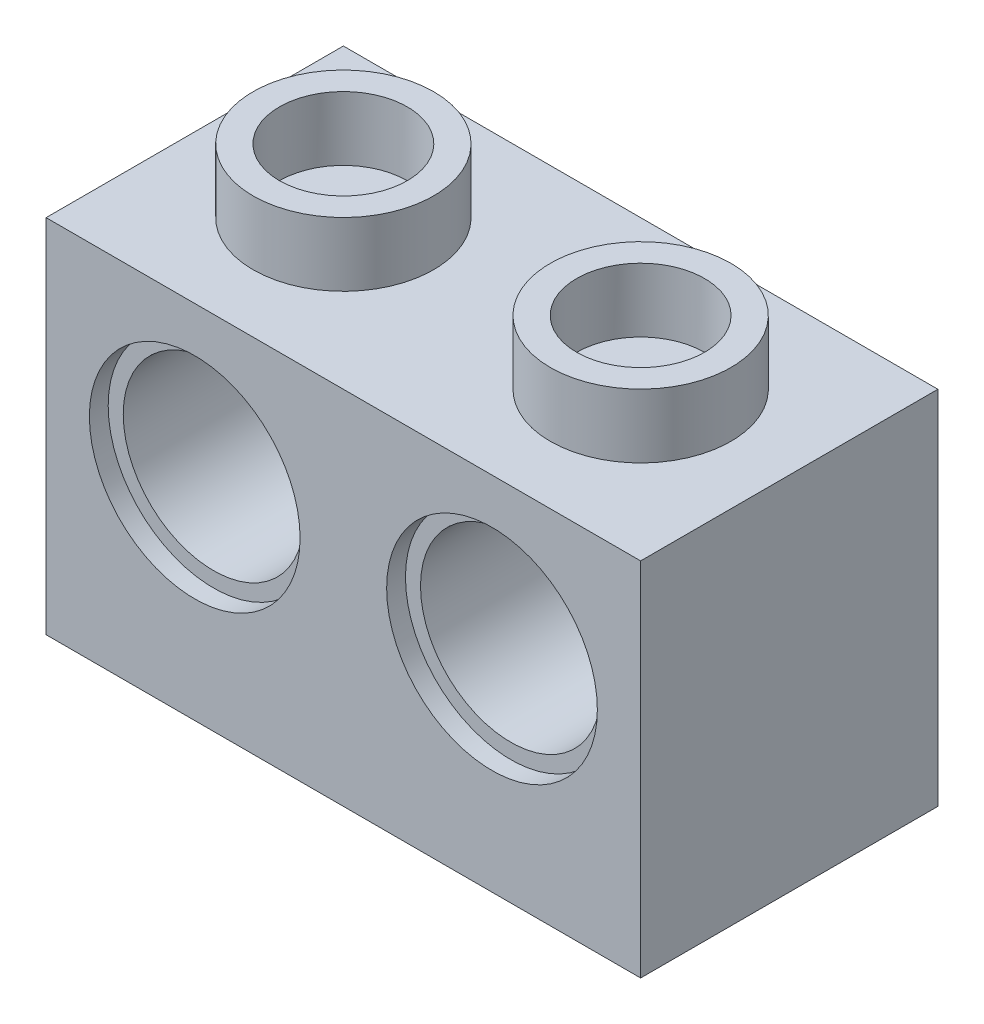
ISO-10303-21;
HEADER;
FILE_DESCRIPTION(('STEP AP214'),'2;1');
FILE_NAME('part.step','',(''),(''),'','','');
FILE_SCHEMA(('AUTOMOTIVE_DESIGN { 1 0 10303 214 1 1 1 1 }'));
ENDSEC;
DATA;
#1=APPLICATION_CONTEXT('core data for automotive mechanical design processes');
#2=APPLICATION_PROTOCOL_DEFINITION('international standard','automotive_design',2000,#1);
#3=PRODUCT_CONTEXT('',#1,'mechanical');
#4=PRODUCT('Part','Part','',(#3));
#5=PRODUCT_RELATED_PRODUCT_CATEGORY('part','',(#4));
#6=PRODUCT_DEFINITION_FORMATION('','',#4);
#7=PRODUCT_DEFINITION_CONTEXT('part definition',#1,'design');
#8=PRODUCT_DEFINITION('design','',#6,#7);
#9=PRODUCT_DEFINITION_SHAPE('','',#8);
#10=(LENGTH_UNIT() NAMED_UNIT(*) SI_UNIT(.MILLI.,.METRE.));
#11=(NAMED_UNIT(*) PLANE_ANGLE_UNIT() SI_UNIT($,.RADIAN.));
#12=(NAMED_UNIT(*) SI_UNIT($,.STERADIAN.) SOLID_ANGLE_UNIT());
#13=UNCERTAINTY_MEASURE_WITH_UNIT(LENGTH_MEASURE(1.E-05),#10,'distance_accuracy_value','');
#14=(GEOMETRIC_REPRESENTATION_CONTEXT(3) GLOBAL_UNCERTAINTY_ASSIGNED_CONTEXT((#13)) GLOBAL_UNIT_ASSIGNED_CONTEXT((#10,
#11,#12)) REPRESENTATION_CONTEXT('',''));
#15=CARTESIAN_POINT('',(0.,0.,0.));
#16=DIRECTION('',(0.,0.,1.));
#17=DIRECTION('',(1.,0.,0.));
#18=AXIS2_PLACEMENT_3D('',#15,#16,#17);
#19=CARTESIAN_POINT('',(3.95,5.5991623790835,-9.6));
#20=DIRECTION('',(0.,0.,1.));
#21=DIRECTION('',(1.,0.,0.));
#22=AXIS2_PLACEMENT_3D('',#19,#20,#21);
#23=CYLINDRICAL_SURFACE('',#22,2.4);
#24=CARTESIAN_POINT('',(3.95,5.5991623790835,-0.5));
#25=DIRECTION('',(0.,0.,1.));
#26=DIRECTION('',(1.,0.,0.));
#27=AXIS2_PLACEMENT_3D('',#24,#25,#26);
#28=CIRCLE('',#27,2.4);
#29=CARTESIAN_POINT('',(6.35,5.5991623790835,-0.5));
#30=VERTEX_POINT('',#29);
#31=EDGE_CURVE('E125',#30,#30,#28,.F.);
#32=ORIENTED_EDGE('',*,*,#31,.F.);
#33=EDGE_LOOP('',(#32));
#34=FACE_BOUND('',#33,.T.);
#35=CARTESIAN_POINT('',(3.95,5.5991623790835,-7.4));
#36=DIRECTION('',(0.,0.,-1.));
#37=DIRECTION('',(-1.,0.,0.));
#38=AXIS2_PLACEMENT_3D('',#35,#36,#37);
#39=CIRCLE('',#38,2.4);
#40=CARTESIAN_POINT('',(1.55,5.5991623790835,-7.4));
#41=VERTEX_POINT('',#40);
#42=EDGE_CURVE('E116',#41,#41,#39,.F.);
#43=ORIENTED_EDGE('',*,*,#42,.F.);
#44=EDGE_LOOP('',(#43));
#45=FACE_BOUND('',#44,.T.);
#46=ADVANCED_FACE('F32',(#34,#45),#23,.F.);
#47=CARTESIAN_POINT('',(0.,9.6,0.));
#48=DIRECTION('',(1.,0.,0.));
#49=DIRECTION('',(0.,0.,-1.));
#50=AXIS2_PLACEMENT_3D('',#47,#48,#49);
#51=PLANE('',#50);
#52=DIRECTION('',(0.,0.,1.));
#53=VECTOR('',#52,1.);
#54=CARTESIAN_POINT('',(0.,0.,0.));
#55=LINE('',#54,#53);
#56=CARTESIAN_POINT('',(0.,0.,-7.9));
#57=VERTEX_POINT('',#56);
#58=CARTESIAN_POINT('',(0.,0.,0.));
#59=VERTEX_POINT('',#58);
#60=EDGE_CURVE('E80',#57,#59,#55,.T.);
#61=ORIENTED_EDGE('',*,*,#60,.T.);
#62=DIRECTION('',(0.,-1.,0.));
#63=VECTOR('',#62,1.);
#64=CARTESIAN_POINT('',(0.,9.6,0.));
#65=LINE('',#64,#63);
#66=CARTESIAN_POINT('',(0.,9.6,0.));
#67=VERTEX_POINT('',#66);
#68=EDGE_CURVE('E36',#67,#59,#65,.T.);
#69=ORIENTED_EDGE('',*,*,#68,.F.);
#70=DIRECTION('',(0.,0.,1.));
#71=VECTOR('',#70,1.);
#72=CARTESIAN_POINT('',(0.,9.6,0.));
#73=LINE('',#72,#71);
#74=CARTESIAN_POINT('',(0.,9.6,-7.9));
#75=VERTEX_POINT('',#74);
#76=EDGE_CURVE('E82',#75,#67,#73,.T.);
#77=ORIENTED_EDGE('',*,*,#76,.F.);
#78=DIRECTION('',(0.,-1.,0.));
#79=VECTOR('',#78,1.);
#80=CARTESIAN_POINT('',(0.,9.6,-7.9));
#81=LINE('',#80,#79);
#82=EDGE_CURVE('E137',#75,#57,#81,.T.);
#83=ORIENTED_EDGE('',*,*,#82,.T.);
#84=EDGE_LOOP('',(#61,#69,#77,#83));
#85=FACE_BOUND('',#84,.T.);
#86=ADVANCED_FACE('F34',(#85),#51,.F.);
#87=CARTESIAN_POINT('',(0.,9.6,0.));
#88=DIRECTION('',(0.,0.,-1.));
#89=DIRECTION('',(-1.,0.,0.));
#90=AXIS2_PLACEMENT_3D('',#87,#88,#89);
#91=PLANE('',#90);
#92=CARTESIAN_POINT('',(3.95,5.5991623790835,0.));
#93=DIRECTION('',(0.,0.,1.));
#94=DIRECTION('',(1.,0.,0.));
#95=AXIS2_PLACEMENT_3D('',#92,#93,#94);
#96=CIRCLE('',#95,2.8);
#97=CARTESIAN_POINT('',(6.75,5.5991623790835,0.));
#98=VERTEX_POINT('',#97);
#99=EDGE_CURVE('E122',#98,#98,#96,.T.);
#100=ORIENTED_EDGE('',*,*,#99,.F.);
#101=EDGE_LOOP('',(#100));
#102=FACE_BOUND('',#101,.T.);
#103=DIRECTION('',(1.,0.,0.));
#104=VECTOR('',#103,1.);
#105=CARTESIAN_POINT('',(0.,0.,0.));
#106=LINE('',#105,#104);
#107=CARTESIAN_POINT('',(15.8,0.,0.));
#108=VERTEX_POINT('',#107);
#109=EDGE_CURVE('E62',#59,#108,#106,.T.);
#110=ORIENTED_EDGE('',*,*,#109,.T.);
#111=DIRECTION('',(0.,-1.,0.));
#112=VECTOR('',#111,1.);
#113=CARTESIAN_POINT('',(15.8,9.6,0.));
#114=LINE('',#113,#112);
#115=CARTESIAN_POINT('',(15.8,9.6,0.));
#116=VERTEX_POINT('',#115);
#117=EDGE_CURVE('E90',#116,#108,#114,.T.);
#118=ORIENTED_EDGE('',*,*,#117,.F.);
#119=DIRECTION('',(1.,0.,0.));
#120=VECTOR('',#119,1.);
#121=CARTESIAN_POINT('',(0.,9.6,0.));
#122=LINE('',#121,#120);
#123=EDGE_CURVE('E134',#67,#116,#122,.T.);
#124=ORIENTED_EDGE('',*,*,#123,.F.);
#125=ORIENTED_EDGE('',*,*,#68,.T.);
#126=EDGE_LOOP('',(#110,#118,#124,#125));
#127=FACE_BOUND('',#126,.T.);
#128=CARTESIAN_POINT('',(11.85,5.5991623790835,0.));
#129=DIRECTION('',(0.,0.,-1.));
#130=DIRECTION('',(-1.,0.,0.));
#131=AXIS2_PLACEMENT_3D('',#128,#129,#130);
#132=CIRCLE('',#131,2.8);
#133=CARTESIAN_POINT('',(9.05,5.5991623790835,0.));
#134=VERTEX_POINT('',#133);
#135=EDGE_CURVE('E265',#134,#134,#132,.T.);
#136=ORIENTED_EDGE('',*,*,#135,.T.);
#137=EDGE_LOOP('',(#136));
#138=FACE_BOUND('',#137,.T.);
#139=ADVANCED_FACE('F143',(#102,#127,#138),#91,.F.);
#140=CARTESIAN_POINT('',(0.,9.6,-7.9));
#141=DIRECTION('',(0.,0.,1.));
#142=DIRECTION('',(1.,0.,0.));
#143=AXIS2_PLACEMENT_3D('',#140,#141,#142);
#144=PLANE('',#143);
#145=CARTESIAN_POINT('',(3.95,5.5991623790835,-7.9));
#146=DIRECTION('',(0.,0.,-1.));
#147=DIRECTION('',(-1.,0.,0.));
#148=AXIS2_PLACEMENT_3D('',#145,#146,#147);
#149=CIRCLE('',#148,2.8);
#150=CARTESIAN_POINT('',(1.15,5.5991623790835,-7.9));
#151=VERTEX_POINT('',#150);
#152=EDGE_CURVE('E114',#151,#151,#149,.T.);
#153=ORIENTED_EDGE('',*,*,#152,.F.);
#154=EDGE_LOOP('',(#153));
#155=FACE_BOUND('',#154,.T.);
#156=DIRECTION('',(-1.,0.,0.));
#157=VECTOR('',#156,1.);
#158=CARTESIAN_POINT('',(0.,0.,-7.9));
#159=LINE('',#158,#157);
#160=CARTESIAN_POINT('',(15.8,0.,-7.9));
#161=VERTEX_POINT('',#160);
#162=EDGE_CURVE('E75',#161,#57,#159,.T.);
#163=ORIENTED_EDGE('',*,*,#162,.T.);
#164=ORIENTED_EDGE('',*,*,#82,.F.);
#165=DIRECTION('',(-1.,0.,0.));
#166=VECTOR('',#165,1.);
#167=CARTESIAN_POINT('',(0.,9.6,-7.9));
#168=LINE('',#167,#166);
#169=CARTESIAN_POINT('',(15.8,9.6,-7.9));
#170=VERTEX_POINT('',#169);
#171=EDGE_CURVE('E50',#170,#75,#168,.T.);
#172=ORIENTED_EDGE('',*,*,#171,.F.);
#173=DIRECTION('',(0.,-1.,0.));
#174=VECTOR('',#173,1.);
#175=CARTESIAN_POINT('',(15.8,9.6,-7.9));
#176=LINE('',#175,#174);
#177=EDGE_CURVE('E85',#170,#161,#176,.T.);
#178=ORIENTED_EDGE('',*,*,#177,.T.);
#179=EDGE_LOOP('',(#163,#164,#172,#178));
#180=FACE_BOUND('',#179,.T.);
#181=CARTESIAN_POINT('',(11.85,5.5991623790835,-7.9));
#182=DIRECTION('',(0.,0.,1.));
#183=DIRECTION('',(1.,0.,0.));
#184=AXIS2_PLACEMENT_3D('',#181,#182,#183);
#185=CIRCLE('',#184,2.8);
#186=CARTESIAN_POINT('',(14.65,5.5991623790835,-7.9));
#187=VERTEX_POINT('',#186);
#188=EDGE_CURVE('E253',#187,#187,#185,.T.);
#189=ORIENTED_EDGE('',*,*,#188,.T.);
#190=EDGE_LOOP('',(#189));
#191=FACE_BOUND('',#190,.T.);
#192=ADVANCED_FACE('F86',(#155,#180,#191),#144,.F.);
#193=CARTESIAN_POINT('',(0.,9.6,0.));
#194=DIRECTION('',(0.,-1.,0.));
#195=DIRECTION('',(0.,0.,-1.));
#196=AXIS2_PLACEMENT_3D('',#193,#194,#195);
#197=PLANE('',#196);
#198=CARTESIAN_POINT('',(3.95,9.6,-3.95));
#199=DIRECTION('',(0.,1.,0.));
#200=DIRECTION('',(0.,0.,1.));
#201=AXIS2_PLACEMENT_3D('',#198,#199,#200);
#202=CIRCLE('',#201,2.4);
#203=CARTESIAN_POINT('',(3.95,9.6,-1.55));
#204=VERTEX_POINT('',#203);
#205=EDGE_CURVE('E11',#204,#204,#202,.T.);
#206=ORIENTED_EDGE('',*,*,#205,.F.);
#207=EDGE_LOOP('',(#206));
#208=FACE_BOUND('',#207,.T.);
#209=ORIENTED_EDGE('',*,*,#76,.T.);
#210=ORIENTED_EDGE('',*,*,#123,.T.);
#211=DIRECTION('',(0.,0.,1.));
#212=VECTOR('',#211,1.);
#213=CARTESIAN_POINT('',(15.8,9.6,0.));
#214=LINE('',#213,#212);
#215=EDGE_CURVE('E91',#170,#116,#214,.T.);
#216=ORIENTED_EDGE('',*,*,#215,.F.);
#217=ORIENTED_EDGE('',*,*,#171,.T.);
#218=EDGE_LOOP('',(#209,#210,#216,#217));
#219=FACE_BOUND('',#218,.T.);
#220=CARTESIAN_POINT('',(11.85,9.6,-3.95));
#221=DIRECTION('',(0.,-1.,0.));
#222=DIRECTION('',(0.,0.,1.));
#223=AXIS2_PLACEMENT_3D('',#220,#221,#222);
#224=CIRCLE('',#223,2.4);
#225=CARTESIAN_POINT('',(11.85,9.6,-1.55));
#226=VERTEX_POINT('',#225);
#227=EDGE_CURVE('E105',#226,#226,#224,.T.);
#228=ORIENTED_EDGE('',*,*,#227,.T.);
#229=EDGE_LOOP('',(#228));
#230=FACE_BOUND('',#229,.T.);
#231=ADVANCED_FACE('F161',(#208,#219,#230),#197,.F.);
#232=CARTESIAN_POINT('',(0.,0.,0.));
#233=DIRECTION('',(0.,-1.,0.));
#234=DIRECTION('',(0.,0.,-1.));
#235=AXIS2_PLACEMENT_3D('',#232,#233,#234);
#236=PLANE('',#235);
#237=ORIENTED_EDGE('',*,*,#60,.F.);
#238=ORIENTED_EDGE('',*,*,#162,.F.);
#239=DIRECTION('',(0.,0.,1.));
#240=VECTOR('',#239,1.);
#241=CARTESIAN_POINT('',(15.8,0.,0.));
#242=LINE('',#241,#240);
#243=EDGE_CURVE('E78',#161,#108,#242,.T.);
#244=ORIENTED_EDGE('',*,*,#243,.T.);
#245=ORIENTED_EDGE('',*,*,#109,.F.);
#246=EDGE_LOOP('',(#237,#238,#244,#245));
#247=FACE_BOUND('',#246,.T.);
#248=ADVANCED_FACE('F76',(#247),#236,.T.);
#249=CARTESIAN_POINT('',(3.95,5.5991623790835,-0.5));
#250=DIRECTION('',(0.,0.,1.));
#251=DIRECTION('',(1.,0.,0.));
#252=AXIS2_PLACEMENT_3D('',#249,#250,#251);
#253=CYLINDRICAL_SURFACE('',#252,2.8);
#254=CARTESIAN_POINT('',(3.95,5.5991623790835,-0.5));
#255=DIRECTION('',(0.,0.,1.));
#256=DIRECTION('',(1.,0.,0.));
#257=AXIS2_PLACEMENT_3D('',#254,#255,#256);
#258=CIRCLE('',#257,2.8);
#259=CARTESIAN_POINT('',(6.75,5.5991623790835,-0.5));
#260=VERTEX_POINT('',#259);
#261=EDGE_CURVE('E128',#260,#260,#258,.T.);
#262=ORIENTED_EDGE('',*,*,#261,.F.);
#263=EDGE_LOOP('',(#262));
#264=FACE_BOUND('',#263,.T.);
#265=ORIENTED_EDGE('',*,*,#99,.T.);
#266=EDGE_LOOP('',(#265));
#267=FACE_BOUND('',#266,.T.);
#268=ADVANCED_FACE('F159',(#264,#267),#253,.F.);
#269=CARTESIAN_POINT('',(0.,0.,-0.5));
#270=DIRECTION('',(0.,0.,1.));
#271=DIRECTION('',(1.,0.,0.));
#272=AXIS2_PLACEMENT_3D('',#269,#270,#271);
#273=PLANE('',#272);
#274=ORIENTED_EDGE('',*,*,#31,.T.);
#275=EDGE_LOOP('',(#274));
#276=FACE_BOUND('',#275,.T.);
#277=ORIENTED_EDGE('',*,*,#261,.T.);
#278=EDGE_LOOP('',(#277));
#279=FACE_BOUND('',#278,.T.);
#280=ADVANCED_FACE('F176',(#276,#279),#273,.T.);
#281=CARTESIAN_POINT('',(3.95,5.5991623790835,-7.4));
#282=DIRECTION('',(0.,0.,-1.));
#283=DIRECTION('',(-1.,0.,0.));
#284=AXIS2_PLACEMENT_3D('',#281,#282,#283);
#285=CYLINDRICAL_SURFACE('',#284,2.8);
#286=CARTESIAN_POINT('',(3.95,5.5991623790835,-7.4));
#287=DIRECTION('',(0.,0.,-1.));
#288=DIRECTION('',(-1.,0.,0.));
#289=AXIS2_PLACEMENT_3D('',#286,#287,#288);
#290=CIRCLE('',#289,2.8);
#291=CARTESIAN_POINT('',(1.15,5.5991623790835,-7.4));
#292=VERTEX_POINT('',#291);
#293=EDGE_CURVE('E119',#292,#292,#290,.T.);
#294=ORIENTED_EDGE('',*,*,#293,.F.);
#295=EDGE_LOOP('',(#294));
#296=FACE_BOUND('',#295,.T.);
#297=ORIENTED_EDGE('',*,*,#152,.T.);
#298=EDGE_LOOP('',(#297));
#299=FACE_BOUND('',#298,.T.);
#300=ADVANCED_FACE('F173',(#296,#299),#285,.F.);
#301=CARTESIAN_POINT('',(0.,0.,-7.4));
#302=DIRECTION('',(0.,0.,-1.));
#303=DIRECTION('',(-1.,0.,0.));
#304=AXIS2_PLACEMENT_3D('',#301,#302,#303);
#305=PLANE('',#304);
#306=ORIENTED_EDGE('',*,*,#42,.T.);
#307=EDGE_LOOP('',(#306));
#308=FACE_BOUND('',#307,.T.);
#309=ORIENTED_EDGE('',*,*,#293,.T.);
#310=EDGE_LOOP('',(#309));
#311=FACE_BOUND('',#310,.T.);
#312=ADVANCED_FACE('F175',(#308,#311),#305,.T.);
#313=CARTESIAN_POINT('',(3.95,11.3,-3.95));
#314=DIRECTION('',(0.,-1.,0.));
#315=DIRECTION('',(0.,0.,-1.));
#316=AXIS2_PLACEMENT_3D('',#313,#314,#315);
#317=CYLINDRICAL_SURFACE('',#316,2.4);
#318=CARTESIAN_POINT('',(3.95,11.3,-3.95));
#319=DIRECTION('',(0.,1.,0.));
#320=DIRECTION('',(0.,0.,1.));
#321=AXIS2_PLACEMENT_3D('',#318,#319,#320);
#322=CIRCLE('',#321,2.4);
#323=CARTESIAN_POINT('',(3.95,11.3,-1.55));
#324=VERTEX_POINT('',#323);
#325=EDGE_CURVE('E112',#324,#324,#322,.T.);
#326=ORIENTED_EDGE('',*,*,#325,.F.);
#327=EDGE_LOOP('',(#326));
#328=FACE_BOUND('',#327,.T.);
#329=ORIENTED_EDGE('',*,*,#205,.T.);
#330=EDGE_LOOP('',(#329));
#331=FACE_BOUND('',#330,.T.);
#332=ADVANCED_FACE('F183',(#328,#331),#317,.T.);
#333=CARTESIAN_POINT('',(3.95,11.3,-3.95));
#334=DIRECTION('',(0.,1.,0.));
#335=DIRECTION('',(0.,0.,1.));
#336=AXIS2_PLACEMENT_3D('',#333,#334,#335);
#337=PLANE('',#336);
#338=CARTESIAN_POINT('',(3.95,11.3,-3.95));
#339=DIRECTION('',(0.,1.,0.));
#340=DIRECTION('',(0.,0.,1.));
#341=AXIS2_PLACEMENT_3D('',#338,#339,#340);
#342=CIRCLE('',#341,1.7);
#343=CARTESIAN_POINT('',(3.95,11.3,-2.25));
#344=VERTEX_POINT('',#343);
#345=EDGE_CURVE('E106',#344,#344,#342,.T.);
#346=ORIENTED_EDGE('',*,*,#345,.F.);
#347=EDGE_LOOP('',(#346));
#348=FACE_BOUND('',#347,.T.);
#349=ORIENTED_EDGE('',*,*,#325,.T.);
#350=EDGE_LOOP('',(#349));
#351=FACE_BOUND('',#350,.T.);
#352=ADVANCED_FACE('F191',(#348,#351),#337,.T.);
#353=CARTESIAN_POINT('',(0.,9.6,0.));
#354=DIRECTION('',(0.,-1.,0.));
#355=DIRECTION('',(0.,0.,-1.));
#356=AXIS2_PLACEMENT_3D('',#353,#354,#355);
#357=PLANE('',#356);
#358=CARTESIAN_POINT('',(3.95,9.6,-3.95));
#359=DIRECTION('',(0.,-1.,0.));
#360=DIRECTION('',(0.,0.,-1.));
#361=AXIS2_PLACEMENT_3D('',#358,#359,#360);
#362=CIRCLE('',#361,1.7);
#363=CARTESIAN_POINT('',(3.95,9.6,-5.65));
#364=VERTEX_POINT('',#363);
#365=EDGE_CURVE('E109',#364,#364,#362,.F.);
#366=ORIENTED_EDGE('',*,*,#365,.T.);
#367=EDGE_LOOP('',(#366));
#368=FACE_BOUND('',#367,.T.);
#369=ADVANCED_FACE('F195',(#368),#357,.F.);
#370=CARTESIAN_POINT('',(3.95,4.79167388793148,-3.95));
#371=DIRECTION('',(0.,1.,0.));
#372=DIRECTION('',(0.,0.,1.));
#373=AXIS2_PLACEMENT_3D('',#370,#371,#372);
#374=CYLINDRICAL_SURFACE('',#373,1.7);
#375=ORIENTED_EDGE('',*,*,#345,.T.);
#376=EDGE_LOOP('',(#375));
#377=FACE_BOUND('',#376,.T.);
#378=ORIENTED_EDGE('',*,*,#365,.F.);
#379=EDGE_LOOP('',(#378));
#380=FACE_BOUND('',#379,.T.);
#381=ADVANCED_FACE('F199',(#377,#380),#374,.F.);
#382=CARTESIAN_POINT('',(11.85,5.5991623790835,-9.6));
#383=DIRECTION('',(0.,0.,1.));
#384=DIRECTION('',(-1.,0.,0.));
#385=AXIS2_PLACEMENT_3D('',#382,#383,#384);
#386=CYLINDRICAL_SURFACE('',#385,2.4);
#387=CARTESIAN_POINT('',(11.85,5.5991623790835,-0.5));
#388=DIRECTION('',(0.,0.,-1.));
#389=DIRECTION('',(-1.,0.,0.));
#390=AXIS2_PLACEMENT_3D('',#387,#388,#389);
#391=CIRCLE('',#390,2.4);
#392=CARTESIAN_POINT('',(9.45,5.5991623790835,-0.5));
#393=VERTEX_POINT('',#392);
#394=EDGE_CURVE('E100',#393,#393,#391,.F.);
#395=ORIENTED_EDGE('',*,*,#394,.T.);
#396=EDGE_LOOP('',(#395));
#397=FACE_BOUND('',#396,.T.);
#398=CARTESIAN_POINT('',(11.85,5.5991623790835,-7.4));
#399=DIRECTION('',(0.,0.,1.));
#400=DIRECTION('',(1.,0.,0.));
#401=AXIS2_PLACEMENT_3D('',#398,#399,#400);
#402=CIRCLE('',#401,2.4);
#403=CARTESIAN_POINT('',(14.25,5.5991623790835,-7.4));
#404=VERTEX_POINT('',#403);
#405=EDGE_CURVE('E259',#404,#404,#402,.F.);
#406=ORIENTED_EDGE('',*,*,#405,.T.);
#407=EDGE_LOOP('',(#406));
#408=FACE_BOUND('',#407,.T.);
#409=ADVANCED_FACE('F203',(#397,#408),#386,.F.);
#410=CARTESIAN_POINT('',(15.8,9.6,0.));
#411=DIRECTION('',(-1.,0.,0.));
#412=DIRECTION('',(0.,0.,-1.));
#413=AXIS2_PLACEMENT_3D('',#410,#411,#412);
#414=PLANE('',#413);
#415=ORIENTED_EDGE('',*,*,#243,.F.);
#416=ORIENTED_EDGE('',*,*,#177,.F.);
#417=ORIENTED_EDGE('',*,*,#215,.T.);
#418=ORIENTED_EDGE('',*,*,#117,.T.);
#419=EDGE_LOOP('',(#415,#416,#417,#418));
#420=FACE_BOUND('',#419,.T.);
#421=ADVANCED_FACE('F94',(#420),#414,.F.);
#422=CARTESIAN_POINT('',(11.85,5.5991623790835,-0.5));
#423=DIRECTION('',(0.,0.,1.));
#424=DIRECTION('',(-1.,0.,0.));
#425=AXIS2_PLACEMENT_3D('',#422,#423,#424);
#426=CYLINDRICAL_SURFACE('',#425,2.8);
#427=CARTESIAN_POINT('',(11.85,5.5991623790835,-0.5));
#428=DIRECTION('',(0.,0.,-1.));
#429=DIRECTION('',(-1.,0.,0.));
#430=AXIS2_PLACEMENT_3D('',#427,#428,#429);
#431=CIRCLE('',#430,2.8);
#432=CARTESIAN_POINT('',(9.05,5.5991623790835,-0.5));
#433=VERTEX_POINT('',#432);
#434=EDGE_CURVE('E96',#433,#433,#431,.T.);
#435=ORIENTED_EDGE('',*,*,#434,.T.);
#436=EDGE_LOOP('',(#435));
#437=FACE_BOUND('',#436,.T.);
#438=ORIENTED_EDGE('',*,*,#135,.F.);
#439=EDGE_LOOP('',(#438));
#440=FACE_BOUND('',#439,.T.);
#441=ADVANCED_FACE('F207',(#437,#440),#426,.F.);
#442=CARTESIAN_POINT('',(15.8,0.,-0.5));
#443=DIRECTION('',(0.,0.,1.));
#444=DIRECTION('',(-1.,0.,0.));
#445=AXIS2_PLACEMENT_3D('',#442,#443,#444);
#446=PLANE('',#445);
#447=ORIENTED_EDGE('',*,*,#394,.F.);
#448=EDGE_LOOP('',(#447));
#449=FACE_BOUND('',#448,.T.);
#450=ORIENTED_EDGE('',*,*,#434,.F.);
#451=EDGE_LOOP('',(#450));
#452=FACE_BOUND('',#451,.T.);
#453=ADVANCED_FACE('F213',(#449,#452),#446,.T.);
#454=CARTESIAN_POINT('',(11.85,5.5991623790835,-7.4));
#455=DIRECTION('',(0.,0.,-1.));
#456=DIRECTION('',(1.,0.,0.));
#457=AXIS2_PLACEMENT_3D('',#454,#455,#456);
#458=CYLINDRICAL_SURFACE('',#457,2.8);
#459=CARTESIAN_POINT('',(11.85,5.5991623790835,-7.4));
#460=DIRECTION('',(0.,0.,1.));
#461=DIRECTION('',(1.,0.,0.));
#462=AXIS2_PLACEMENT_3D('',#459,#460,#461);
#463=CIRCLE('',#462,2.8);
#464=CARTESIAN_POINT('',(14.65,5.5991623790835,-7.4));
#465=VERTEX_POINT('',#464);
#466=EDGE_CURVE('E262',#465,#465,#463,.T.);
#467=ORIENTED_EDGE('',*,*,#466,.T.);
#468=EDGE_LOOP('',(#467));
#469=FACE_BOUND('',#468,.T.);
#470=ORIENTED_EDGE('',*,*,#188,.F.);
#471=EDGE_LOOP('',(#470));
#472=FACE_BOUND('',#471,.T.);
#473=ADVANCED_FACE('F217',(#469,#472),#458,.F.);
#474=CARTESIAN_POINT('',(15.8,0.,-7.4));
#475=DIRECTION('',(0.,0.,-1.));
#476=DIRECTION('',(1.,0.,0.));
#477=AXIS2_PLACEMENT_3D('',#474,#475,#476);
#478=PLANE('',#477);
#479=ORIENTED_EDGE('',*,*,#405,.F.);
#480=EDGE_LOOP('',(#479));
#481=FACE_BOUND('',#480,.T.);
#482=ORIENTED_EDGE('',*,*,#466,.F.);
#483=EDGE_LOOP('',(#482));
#484=FACE_BOUND('',#483,.T.);
#485=ADVANCED_FACE('F221',(#481,#484),#478,.T.);
#486=CARTESIAN_POINT('',(11.85,11.3,-3.95));
#487=DIRECTION('',(0.,-1.,0.));
#488=DIRECTION('',(0.,0.,-1.));
#489=AXIS2_PLACEMENT_3D('',#486,#487,#488);
#490=CYLINDRICAL_SURFACE('',#489,2.4);
#491=CARTESIAN_POINT('',(11.85,11.3,-3.95));
#492=DIRECTION('',(0.,-1.,0.));
#493=DIRECTION('',(0.,0.,1.));
#494=AXIS2_PLACEMENT_3D('',#491,#492,#493);
#495=CIRCLE('',#494,2.4);
#496=CARTESIAN_POINT('',(11.85,11.3,-1.55));
#497=VERTEX_POINT('',#496);
#498=EDGE_CURVE('E250',#497,#497,#495,.T.);
#499=ORIENTED_EDGE('',*,*,#498,.T.);
#500=EDGE_LOOP('',(#499));
#501=FACE_BOUND('',#500,.T.);
#502=ORIENTED_EDGE('',*,*,#227,.F.);
#503=EDGE_LOOP('',(#502));
#504=FACE_BOUND('',#503,.T.);
#505=ADVANCED_FACE('F225',(#501,#504),#490,.T.);
#506=CARTESIAN_POINT('',(11.85,11.3,-3.95));
#507=DIRECTION('',(0.,1.,0.));
#508=DIRECTION('',(0.,0.,1.));
#509=AXIS2_PLACEMENT_3D('',#506,#507,#508);
#510=PLANE('',#509);
#511=CARTESIAN_POINT('',(11.85,11.3,-3.95));
#512=DIRECTION('',(0.,-1.,0.));
#513=DIRECTION('',(0.,0.,1.));
#514=AXIS2_PLACEMENT_3D('',#511,#512,#513);
#515=CIRCLE('',#514,1.7);
#516=CARTESIAN_POINT('',(11.85,11.3,-2.25));
#517=VERTEX_POINT('',#516);
#518=EDGE_CURVE('E246',#517,#517,#515,.T.);
#519=ORIENTED_EDGE('',*,*,#518,.T.);
#520=EDGE_LOOP('',(#519));
#521=FACE_BOUND('',#520,.T.);
#522=ORIENTED_EDGE('',*,*,#498,.F.);
#523=EDGE_LOOP('',(#522));
#524=FACE_BOUND('',#523,.T.);
#525=ADVANCED_FACE('F229',(#521,#524),#510,.T.);
#526=CARTESIAN_POINT('',(15.8,9.6,0.));
#527=DIRECTION('',(0.,-1.,0.));
#528=DIRECTION('',(0.,0.,-1.));
#529=AXIS2_PLACEMENT_3D('',#526,#527,#528);
#530=PLANE('',#529);
#531=CARTESIAN_POINT('',(11.85,9.6,-3.95));
#532=DIRECTION('',(0.,1.,0.));
#533=DIRECTION('',(0.,0.,-1.));
#534=AXIS2_PLACEMENT_3D('',#531,#532,#533);
#535=CIRCLE('',#534,1.7);
#536=CARTESIAN_POINT('',(11.85,9.6,-5.65));
#537=VERTEX_POINT('',#536);
#538=EDGE_CURVE('E249',#537,#537,#535,.F.);
#539=ORIENTED_EDGE('',*,*,#538,.F.);
#540=EDGE_LOOP('',(#539));
#541=FACE_BOUND('',#540,.T.);
#542=ADVANCED_FACE('F233',(#541),#530,.F.);
#543=CARTESIAN_POINT('',(11.85,4.79167388793148,-3.95));
#544=DIRECTION('',(0.,1.,0.));
#545=DIRECTION('',(0.,0.,1.));
#546=AXIS2_PLACEMENT_3D('',#543,#544,#545);
#547=CYLINDRICAL_SURFACE('',#546,1.7);
#548=ORIENTED_EDGE('',*,*,#518,.F.);
#549=EDGE_LOOP('',(#548));
#550=FACE_BOUND('',#549,.T.);
#551=ORIENTED_EDGE('',*,*,#538,.T.);
#552=EDGE_LOOP('',(#551));
#553=FACE_BOUND('',#552,.T.);
#554=ADVANCED_FACE('F237',(#550,#553),#547,.F.);
#555=CLOSED_SHELL('',(#46,#86,#139,#192,#231,#248,#268,#280,#300,#312,#332,#352,#369,#381,#409,
#421,#441,#453,#473,#485,#505,#525,#542,#554));
#556=MANIFOLD_SOLID_BREP('B2',#555);
#557=ADVANCED_BREP_SHAPE_REPRESENTATION('',(#18,#556),#14);
#558=SHAPE_DEFINITION_REPRESENTATION(#9,#557);
ENDSEC;
END-ISO-10303-21;
